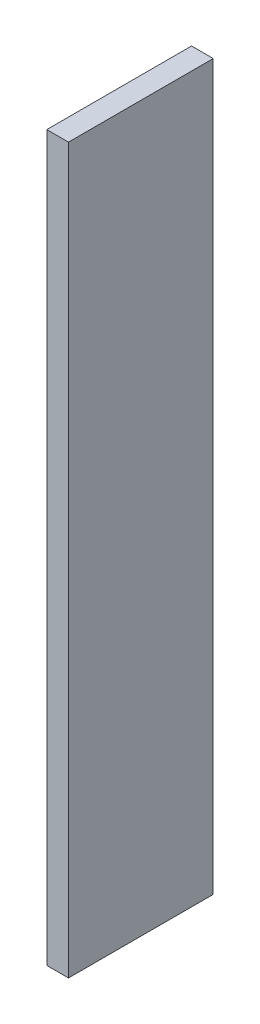
ISO-10303-21;
HEADER;
FILE_DESCRIPTION(('STEP AP214'),'2;1');
FILE_NAME('part.step','',(''),(''),'','','');
FILE_SCHEMA(('AUTOMOTIVE_DESIGN { 1 0 10303 214 1 1 1 1 }'));
ENDSEC;
DATA;
#1=APPLICATION_CONTEXT('core data for automotive mechanical design processes');
#2=APPLICATION_PROTOCOL_DEFINITION('international standard','automotive_design',2000,#1);
#3=PRODUCT_CONTEXT('',#1,'mechanical');
#4=PRODUCT('Part','Part','',(#3));
#5=PRODUCT_RELATED_PRODUCT_CATEGORY('part','',(#4));
#6=PRODUCT_DEFINITION_FORMATION('','',#4);
#7=PRODUCT_DEFINITION_CONTEXT('part definition',#1,'design');
#8=PRODUCT_DEFINITION('design','',#6,#7);
#9=PRODUCT_DEFINITION_SHAPE('','',#8);
#10=(LENGTH_UNIT() NAMED_UNIT(*) SI_UNIT(.MILLI.,.METRE.));
#11=(NAMED_UNIT(*) PLANE_ANGLE_UNIT() SI_UNIT($,.RADIAN.));
#12=(NAMED_UNIT(*) SI_UNIT($,.STERADIAN.) SOLID_ANGLE_UNIT());
#13=UNCERTAINTY_MEASURE_WITH_UNIT(LENGTH_MEASURE(1.E-05),#10,'distance_accuracy_value','');
#14=(GEOMETRIC_REPRESENTATION_CONTEXT(3) GLOBAL_UNCERTAINTY_ASSIGNED_CONTEXT((#13)) GLOBAL_UNIT_ASSIGNED_CONTEXT((#10,
#11,#12)) REPRESENTATION_CONTEXT('',''));
#15=CARTESIAN_POINT('',(0.,0.,0.));
#16=DIRECTION('',(0.,0.,1.));
#17=DIRECTION('',(1.,0.,0.));
#18=AXIS2_PLACEMENT_3D('',#15,#16,#17);
#19=CARTESIAN_POINT('',(-15.0000000000001,500.,100.));
#20=DIRECTION('',(1.,0.,0.));
#21=DIRECTION('',(0.,1.,0.));
#22=AXIS2_PLACEMENT_3D('',#19,#20,#21);
#23=PLANE('',#22);
#24=CARTESIAN_POINT('',(-15.0000000000001,375.,0.));
#25=DIRECTION('',(1.,0.,0.));
#26=DIRECTION('',(0.,1.,0.));
#27=AXIS2_PLACEMENT_3D('',#24,#25,#26);
#28=CIRCLE('',#27,50.);
#29=CARTESIAN_POINT('',(-15.0000000000001,425.,0.));
#30=VERTEX_POINT('',#29);
#31=EDGE_CURVE('E112',#30,#30,#28,.F.);
#32=ORIENTED_EDGE('',*,*,#31,.F.);
#33=EDGE_LOOP('',(#32));
#34=FACE_BOUND('',#33,.T.);
#35=DIRECTION('',(0.,-1.,0.));
#36=VECTOR('',#35,1.);
#37=CARTESIAN_POINT('',(-15.0000000000001,500.,-100.));
#38=LINE('',#37,#36);
#39=CARTESIAN_POINT('',(-15.0000000000001,500.,-100.));
#40=VERTEX_POINT('',#39);
#41=CARTESIAN_POINT('',(-15.,-500.,-100.));
#42=VERTEX_POINT('',#41);
#43=EDGE_CURVE('E68',#40,#42,#38,.T.);
#44=ORIENTED_EDGE('',*,*,#43,.T.);
#45=DIRECTION('',(0.,0.,-1.));
#46=VECTOR('',#45,1.);
#47=CARTESIAN_POINT('',(-15.,-500.,100.));
#48=LINE('',#47,#46);
#49=CARTESIAN_POINT('',(-15.,-500.,100.));
#50=VERTEX_POINT('',#49);
#51=EDGE_CURVE('E94',#50,#42,#48,.T.);
#52=ORIENTED_EDGE('',*,*,#51,.F.);
#53=DIRECTION('',(0.,-1.,0.));
#54=VECTOR('',#53,1.);
#55=CARTESIAN_POINT('',(-15.0000000000001,500.,100.));
#56=LINE('',#55,#54);
#57=CARTESIAN_POINT('',(-15.0000000000001,500.,100.));
#58=VERTEX_POINT('',#57);
#59=EDGE_CURVE('E85',#58,#50,#56,.T.);
#60=ORIENTED_EDGE('',*,*,#59,.F.);
#61=DIRECTION('',(0.,0.,-1.));
#62=VECTOR('',#61,1.);
#63=CARTESIAN_POINT('',(-15.0000000000001,500.,100.));
#64=LINE('',#63,#62);
#65=EDGE_CURVE('E90',#58,#40,#64,.T.);
#66=ORIENTED_EDGE('',*,*,#65,.T.);
#67=EDGE_LOOP('',(#44,#52,#60,#66));
#68=FACE_BOUND('',#67,.T.);
#69=CARTESIAN_POINT('',(-15.,125.,0.));
#70=DIRECTION('',(1.,0.,0.));
#71=DIRECTION('',(0.,1.,0.));
#72=AXIS2_PLACEMENT_3D('',#69,#70,#71);
#73=CIRCLE('',#72,50.);
#74=CARTESIAN_POINT('',(-15.,175.,0.));
#75=VERTEX_POINT('',#74);
#76=EDGE_CURVE('E115',#75,#75,#73,.F.);
#77=ORIENTED_EDGE('',*,*,#76,.F.);
#78=EDGE_LOOP('',(#77));
#79=FACE_BOUND('',#78,.T.);
#80=CARTESIAN_POINT('',(-15.,-125.,0.));
#81=DIRECTION('',(1.,0.,0.));
#82=DIRECTION('',(0.,1.,0.));
#83=AXIS2_PLACEMENT_3D('',#80,#81,#82);
#84=CIRCLE('',#83,50.);
#85=CARTESIAN_POINT('',(-15.,-75.,0.));
#86=VERTEX_POINT('',#85);
#87=EDGE_CURVE('E118',#86,#86,#84,.F.);
#88=ORIENTED_EDGE('',*,*,#87,.F.);
#89=EDGE_LOOP('',(#88));
#90=FACE_BOUND('',#89,.T.);
#91=CARTESIAN_POINT('',(-15.,-375.,0.));
#92=DIRECTION('',(1.,0.,0.));
#93=DIRECTION('',(0.,1.,0.));
#94=AXIS2_PLACEMENT_3D('',#91,#92,#93);
#95=CIRCLE('',#94,50.);
#96=CARTESIAN_POINT('',(-15.,-325.,0.));
#97=VERTEX_POINT('',#96);
#98=EDGE_CURVE('E43',#97,#97,#95,.F.);
#99=ORIENTED_EDGE('',*,*,#98,.F.);
#100=EDGE_LOOP('',(#99));
#101=FACE_BOUND('',#100,.T.);
#102=ADVANCED_FACE('F34',(#34,#68,#79,#90,#101),#23,.F.);
#103=CARTESIAN_POINT('',(14.9999999999999,500.,100.));
#104=DIRECTION('',(-1.,0.,0.));
#105=DIRECTION('',(0.,-1.,0.));
#106=AXIS2_PLACEMENT_3D('',#103,#104,#105);
#107=PLANE('',#106);
#108=DIRECTION('',(0.,1.,0.));
#109=VECTOR('',#108,1.);
#110=CARTESIAN_POINT('',(14.9999999999999,500.,-100.));
#111=LINE('',#110,#109);
#112=CARTESIAN_POINT('',(15.,-500.,-100.));
#113=VERTEX_POINT('',#112);
#114=CARTESIAN_POINT('',(14.9999999999999,500.,-100.));
#115=VERTEX_POINT('',#114);
#116=EDGE_CURVE('E102',#113,#115,#111,.T.);
#117=ORIENTED_EDGE('',*,*,#116,.T.);
#118=DIRECTION('',(0.,0.,-1.));
#119=VECTOR('',#118,1.);
#120=CARTESIAN_POINT('',(14.9999999999999,500.,100.));
#121=LINE('',#120,#119);
#122=CARTESIAN_POINT('',(14.9999999999999,500.,100.));
#123=VERTEX_POINT('',#122);
#124=EDGE_CURVE('E93',#123,#115,#121,.T.);
#125=ORIENTED_EDGE('',*,*,#124,.F.);
#126=DIRECTION('',(0.,1.,0.));
#127=VECTOR('',#126,1.);
#128=CARTESIAN_POINT('',(14.9999999999999,500.,100.));
#129=LINE('',#128,#127);
#130=CARTESIAN_POINT('',(15.,-500.,100.));
#131=VERTEX_POINT('',#130);
#132=EDGE_CURVE('E87',#131,#123,#129,.T.);
#133=ORIENTED_EDGE('',*,*,#132,.F.);
#134=DIRECTION('',(0.,0.,-1.));
#135=VECTOR('',#134,1.);
#136=CARTESIAN_POINT('',(15.,-500.,100.));
#137=LINE('',#136,#135);
#138=EDGE_CURVE('E98',#131,#113,#137,.T.);
#139=ORIENTED_EDGE('',*,*,#138,.T.);
#140=EDGE_LOOP('',(#117,#125,#133,#139));
#141=FACE_BOUND('',#140,.T.);
#142=ADVANCED_FACE('F129',(#141),#107,.F.);
#143=CARTESIAN_POINT('',(-15.0000000000001,500.,100.));
#144=DIRECTION('',(0.,-1.,0.));
#145=DIRECTION('',(0.,0.,-1.));
#146=AXIS2_PLACEMENT_3D('',#143,#144,#145);
#147=PLANE('',#146);
#148=DIRECTION('',(-1.,0.,0.));
#149=VECTOR('',#148,1.);
#150=CARTESIAN_POINT('',(-15.0000000000001,500.,-100.));
#151=LINE('',#150,#149);
#152=EDGE_CURVE('E92',#115,#40,#151,.T.);
#153=ORIENTED_EDGE('',*,*,#152,.T.);
#154=ORIENTED_EDGE('',*,*,#65,.F.);
#155=DIRECTION('',(-1.,0.,0.));
#156=VECTOR('',#155,1.);
#157=CARTESIAN_POINT('',(-15.0000000000001,500.,100.));
#158=LINE('',#157,#156);
#159=EDGE_CURVE('E82',#123,#58,#158,.T.);
#160=ORIENTED_EDGE('',*,*,#159,.F.);
#161=ORIENTED_EDGE('',*,*,#124,.T.);
#162=EDGE_LOOP('',(#153,#154,#160,#161));
#163=FACE_BOUND('',#162,.T.);
#164=ADVANCED_FACE('F91',(#163),#147,.F.);
#165=CARTESIAN_POINT('',(-15.,-500.,100.));
#166=DIRECTION('',(0.,1.,0.));
#167=DIRECTION('',(0.,0.,1.));
#168=AXIS2_PLACEMENT_3D('',#165,#166,#167);
#169=PLANE('',#168);
#170=DIRECTION('',(1.,0.,0.));
#171=VECTOR('',#170,1.);
#172=CARTESIAN_POINT('',(-15.,-500.,-100.));
#173=LINE('',#172,#171);
#174=EDGE_CURVE('E74',#42,#113,#173,.T.);
#175=ORIENTED_EDGE('',*,*,#174,.T.);
#176=ORIENTED_EDGE('',*,*,#138,.F.);
#177=DIRECTION('',(1.,0.,0.));
#178=VECTOR('',#177,1.);
#179=CARTESIAN_POINT('',(-15.,-500.,100.));
#180=LINE('',#179,#178);
#181=EDGE_CURVE('E51',#50,#131,#180,.T.);
#182=ORIENTED_EDGE('',*,*,#181,.F.);
#183=ORIENTED_EDGE('',*,*,#51,.T.);
#184=EDGE_LOOP('',(#175,#176,#182,#183));
#185=FACE_BOUND('',#184,.T.);
#186=ADVANCED_FACE('F140',(#185),#169,.F.);
#187=CARTESIAN_POINT('',(0.,0.,100.));
#188=DIRECTION('',(0.,0.,1.));
#189=DIRECTION('',(1.,0.,0.));
#190=AXIS2_PLACEMENT_3D('',#187,#188,#189);
#191=PLANE('',#190);
#192=ORIENTED_EDGE('',*,*,#132,.T.);
#193=ORIENTED_EDGE('',*,*,#159,.T.);
#194=ORIENTED_EDGE('',*,*,#59,.T.);
#195=ORIENTED_EDGE('',*,*,#181,.T.);
#196=EDGE_LOOP('',(#192,#193,#194,#195));
#197=FACE_BOUND('',#196,.T.);
#198=ADVANCED_FACE('F83',(#197),#191,.T.);
#199=CARTESIAN_POINT('',(0.,0.,-100.));
#200=DIRECTION('',(0.,0.,1.));
#201=DIRECTION('',(1.,0.,0.));
#202=AXIS2_PLACEMENT_3D('',#199,#200,#201);
#203=PLANE('',#202);
#204=ORIENTED_EDGE('',*,*,#116,.F.);
#205=ORIENTED_EDGE('',*,*,#174,.F.);
#206=ORIENTED_EDGE('',*,*,#43,.F.);
#207=ORIENTED_EDGE('',*,*,#152,.F.);
#208=EDGE_LOOP('',(#204,#205,#206,#207));
#209=FACE_BOUND('',#208,.T.);
#210=ADVANCED_FACE('F199',(#209),#203,.F.);
#211=CARTESIAN_POINT('',(-35.0000000000001,375.,0.));
#212=DIRECTION('',(1.,0.,0.));
#213=DIRECTION('',(0.,1.,0.));
#214=AXIS2_PLACEMENT_3D('',#211,#212,#213);
#215=CYLINDRICAL_SURFACE('',#214,50.);
#216=CARTESIAN_POINT('',(-35.0000000000001,375.,0.));
#217=DIRECTION('',(-1.,0.,0.));
#218=DIRECTION('',(0.,-1.,0.));
#219=AXIS2_PLACEMENT_3D('',#216,#217,#218);
#220=CIRCLE('',#219,50.);
#221=CARTESIAN_POINT('',(-35.0000000000001,325.,0.));
#222=VERTEX_POINT('',#221);
#223=EDGE_CURVE('E105',#222,#222,#220,.T.);
#224=ORIENTED_EDGE('',*,*,#223,.F.);
#225=EDGE_LOOP('',(#224));
#226=FACE_BOUND('',#225,.T.);
#227=ORIENTED_EDGE('',*,*,#31,.T.);
#228=EDGE_LOOP('',(#227));
#229=FACE_BOUND('',#228,.T.);
#230=ADVANCED_FACE('F191',(#226,#229),#215,.T.);
#231=CARTESIAN_POINT('',(-35.0000000000001,375.,0.));
#232=DIRECTION('',(-1.,0.,0.));
#233=DIRECTION('',(0.,-1.,0.));
#234=AXIS2_PLACEMENT_3D('',#231,#232,#233);
#235=PLANE('',#234);
#236=ORIENTED_EDGE('',*,*,#223,.T.);
#237=EDGE_LOOP('',(#236));
#238=FACE_BOUND('',#237,.T.);
#239=ADVANCED_FACE('F183',(#238),#235,.T.);
#240=CARTESIAN_POINT('',(-35.,125.,0.));
#241=DIRECTION('',(1.,0.,0.));
#242=DIRECTION('',(0.,1.,0.));
#243=AXIS2_PLACEMENT_3D('',#240,#241,#242);
#244=CYLINDRICAL_SURFACE('',#243,50.);
#245=CARTESIAN_POINT('',(-35.,125.,0.));
#246=DIRECTION('',(-1.,0.,0.));
#247=DIRECTION('',(0.,-1.,0.));
#248=AXIS2_PLACEMENT_3D('',#245,#246,#247);
#249=CIRCLE('',#248,50.);
#250=CARTESIAN_POINT('',(-35.,75.,0.));
#251=VERTEX_POINT('',#250);
#252=EDGE_CURVE('E264',#251,#251,#249,.T.);
#253=ORIENTED_EDGE('',*,*,#252,.F.);
#254=EDGE_LOOP('',(#253));
#255=FACE_BOUND('',#254,.T.);
#256=ORIENTED_EDGE('',*,*,#76,.T.);
#257=EDGE_LOOP('',(#256));
#258=FACE_BOUND('',#257,.T.);
#259=ADVANCED_FACE('F175',(#255,#258),#244,.T.);
#260=CARTESIAN_POINT('',(-35.,125.,0.));
#261=DIRECTION('',(-1.,0.,0.));
#262=DIRECTION('',(0.,-1.,0.));
#263=AXIS2_PLACEMENT_3D('',#260,#261,#262);
#264=PLANE('',#263);
#265=ORIENTED_EDGE('',*,*,#252,.T.);
#266=EDGE_LOOP('',(#265));
#267=FACE_BOUND('',#266,.T.);
#268=ADVANCED_FACE('F150',(#267),#264,.T.);
#269=CARTESIAN_POINT('',(-35.,-125.,0.));
#270=DIRECTION('',(-1.,0.,0.));
#271=DIRECTION('',(0.,-1.,0.));
#272=AXIS2_PLACEMENT_3D('',#269,#270,#271);
#273=PLANE('',#272);
#274=CARTESIAN_POINT('',(-35.,-125.,0.));
#275=DIRECTION('',(-1.,0.,0.));
#276=DIRECTION('',(0.,-1.,0.));
#277=AXIS2_PLACEMENT_3D('',#274,#275,#276);
#278=CIRCLE('',#277,50.);
#279=CARTESIAN_POINT('',(-35.,-175.,0.));
#280=VERTEX_POINT('',#279);
#281=EDGE_CURVE('E121',#280,#280,#278,.T.);
#282=ORIENTED_EDGE('',*,*,#281,.T.);
#283=EDGE_LOOP('',(#282));
#284=FACE_BOUND('',#283,.T.);
#285=ADVANCED_FACE('F147',(#284),#273,.T.);
#286=CARTESIAN_POINT('',(-35.,-125.,0.));
#287=DIRECTION('',(1.,0.,0.));
#288=DIRECTION('',(0.,1.,0.));
#289=AXIS2_PLACEMENT_3D('',#286,#287,#288);
#290=CYLINDRICAL_SURFACE('',#289,50.);
#291=ORIENTED_EDGE('',*,*,#281,.F.);
#292=EDGE_LOOP('',(#291));
#293=FACE_BOUND('',#292,.T.);
#294=ORIENTED_EDGE('',*,*,#87,.T.);
#295=EDGE_LOOP('',(#294));
#296=FACE_BOUND('',#295,.T.);
#297=ADVANCED_FACE('F144',(#293,#296),#290,.T.);
#298=CARTESIAN_POINT('',(-35.,-375.,0.));
#299=DIRECTION('',(-1.,0.,0.));
#300=DIRECTION('',(0.,-1.,0.));
#301=AXIS2_PLACEMENT_3D('',#298,#299,#300);
#302=PLANE('',#301);
#303=CARTESIAN_POINT('',(-35.,-375.,0.));
#304=DIRECTION('',(-1.,0.,0.));
#305=DIRECTION('',(0.,-1.,0.));
#306=AXIS2_PLACEMENT_3D('',#303,#304,#305);
#307=CIRCLE('',#306,50.);
#308=CARTESIAN_POINT('',(-35.,-425.,0.));
#309=VERTEX_POINT('',#308);
#310=EDGE_CURVE('E11',#309,#309,#307,.T.);
#311=ORIENTED_EDGE('',*,*,#310,.T.);
#312=EDGE_LOOP('',(#311));
#313=FACE_BOUND('',#312,.T.);
#314=ADVANCED_FACE('F36',(#313),#302,.T.);
#315=CARTESIAN_POINT('',(-35.,-375.,0.));
#316=DIRECTION('',(1.,0.,0.));
#317=DIRECTION('',(0.,1.,0.));
#318=AXIS2_PLACEMENT_3D('',#315,#316,#317);
#319=CYLINDRICAL_SURFACE('',#318,50.);
#320=ORIENTED_EDGE('',*,*,#310,.F.);
#321=EDGE_LOOP('',(#320));
#322=FACE_BOUND('',#321,.T.);
#323=ORIENTED_EDGE('',*,*,#98,.T.);
#324=EDGE_LOOP('',(#323));
#325=FACE_BOUND('',#324,.T.);
#326=ADVANCED_FACE('F126',(#322,#325),#319,.T.);
#327=CLOSED_SHELL('',(#102,#142,#164,#186,#198,#210,#230,#239,#259,#268,#285,#297,#314,#326));
#328=MANIFOLD_SOLID_BREP('B2',#327);
#329=ADVANCED_BREP_SHAPE_REPRESENTATION('',(#18,#328),#14);
#330=SHAPE_DEFINITION_REPRESENTATION(#9,#329);
ENDSEC;
END-ISO-10303-21;
